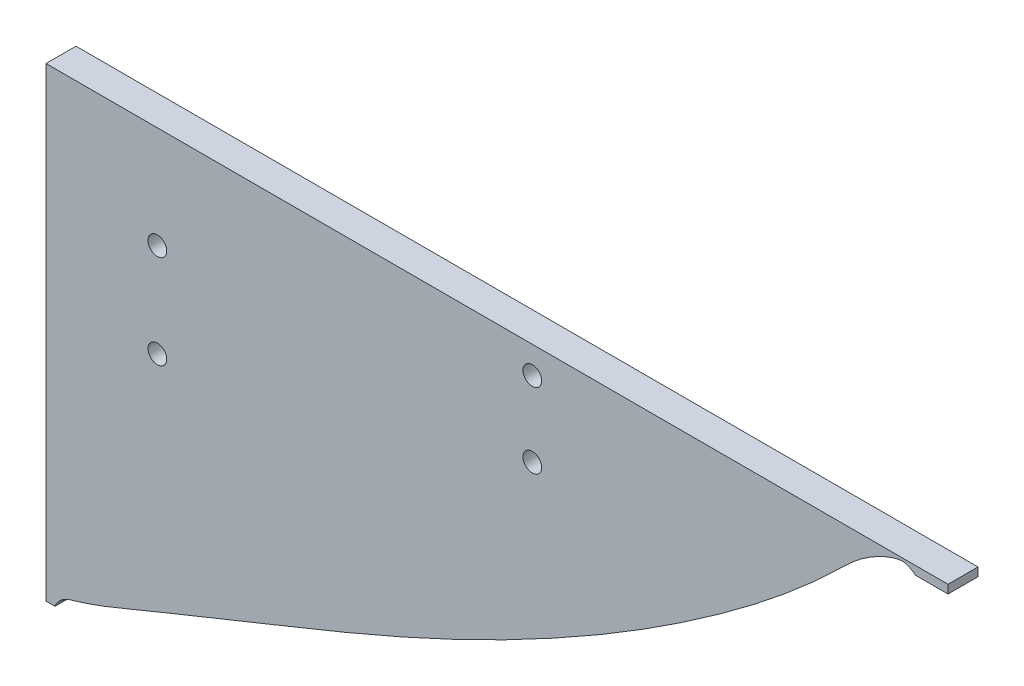
ISO-10303-21;
HEADER;
FILE_DESCRIPTION(('STEP AP214'),'2;1');
FILE_NAME('part.step','',(''),(''),'','','');
FILE_SCHEMA(('AUTOMOTIVE_DESIGN { 1 0 10303 214 1 1 1 1 }'));
ENDSEC;
DATA;
#1=APPLICATION_CONTEXT('core data for automotive mechanical design processes');
#2=APPLICATION_PROTOCOL_DEFINITION('international standard','automotive_design',2000,#1);
#3=PRODUCT_CONTEXT('',#1,'mechanical');
#4=PRODUCT('Part','Part','',(#3));
#5=PRODUCT_RELATED_PRODUCT_CATEGORY('part','',(#4));
#6=PRODUCT_DEFINITION_FORMATION('','',#4);
#7=PRODUCT_DEFINITION_CONTEXT('part definition',#1,'design');
#8=PRODUCT_DEFINITION('design','',#6,#7);
#9=PRODUCT_DEFINITION_SHAPE('','',#8);
#10=(LENGTH_UNIT() NAMED_UNIT(*) SI_UNIT(.MILLI.,.METRE.));
#11=(NAMED_UNIT(*) PLANE_ANGLE_UNIT() SI_UNIT($,.RADIAN.));
#12=(NAMED_UNIT(*) SI_UNIT($,.STERADIAN.) SOLID_ANGLE_UNIT());
#13=UNCERTAINTY_MEASURE_WITH_UNIT(LENGTH_MEASURE(1.E-05),#10,'distance_accuracy_value','');
#14=(GEOMETRIC_REPRESENTATION_CONTEXT(3) GLOBAL_UNCERTAINTY_ASSIGNED_CONTEXT((#13)) GLOBAL_UNIT_ASSIGNED_CONTEXT((#10,
#11,#12)) REPRESENTATION_CONTEXT('',''));
#15=CARTESIAN_POINT('',(0.,0.,0.));
#16=DIRECTION('',(0.,0.,1.));
#17=DIRECTION('',(1.,0.,0.));
#18=AXIS2_PLACEMENT_3D('',#15,#16,#17);
#19=CARTESIAN_POINT('',(-6.88324996712564,-69.5254297062748,124.));
#20=DIRECTION('',(0.,0.,1.));
#21=DIRECTION('',(1.,0.,0.));
#22=AXIS2_PLACEMENT_3D('',#19,#20,#21);
#23=PLANE('',#22);
#24=CARTESIAN_POINT('',(-100.,-50.,124.));
#25=DIRECTION('',(0.,0.,1.));
#26=DIRECTION('',(1.,0.,0.));
#27=AXIS2_PLACEMENT_3D('',#24,#25,#26);
#28=CIRCLE('',#27,2.5);
#29=CARTESIAN_POINT('',(-97.5,-50.,124.));
#30=VERTEX_POINT('',#29);
#31=EDGE_CURVE('E177',#30,#30,#28,.F.);
#32=ORIENTED_EDGE('',*,*,#31,.T.);
#33=EDGE_LOOP('',(#32));
#34=FACE_BOUND('',#33,.T.);
#35=CARTESIAN_POINT('',(0.0705666698621599,-4.96037406111782,124.));
#36=DIRECTION('',(0.,0.,1.));
#37=DIRECTION('',(1.,0.,0.));
#38=AXIS2_PLACEMENT_3D('',#35,#36,#37);
#39=CIRCLE('',#38,2.5);
#40=CARTESIAN_POINT('',(2.57056666986216,-4.96037406111782,124.));
#41=VERTEX_POINT('',#40);
#42=EDGE_CURVE('E165',#41,#41,#39,.F.);
#43=ORIENTED_EDGE('',*,*,#42,.T.);
#44=EDGE_LOOP('',(#43));
#45=FACE_BOUND('',#44,.T.);
#46=DIRECTION('',(0.999999959371241,0.000285057042114839,0.));
#47=VECTOR('',#46,1.);
#48=CARTESIAN_POINT('',(-129.725067732248,-122.005242301533,124.));
#49=LINE('',#48,#47);
#50=CARTESIAN_POINT('',(-129.725067732248,-122.005242301533,124.));
#51=VERTEX_POINT('',#50);
#52=CARTESIAN_POINT('',(-127.32793309838,-122.004558981397,124.));
#53=VERTEX_POINT('',#52);
#54=EDGE_CURVE('E122',#51,#53,#49,.T.);
#55=ORIENTED_EDGE('',*,*,#54,.T.);
#56=CARTESIAN_POINT('',(102.26251898165,-0.00495280443393484,124.));
#57=CARTESIAN_POINT('',(102.174347615,0.149128170390604,124.));
#58=CARTESIAN_POINT('',(102.037797393237,0.266839574242771,124.));
#59=CARTESIAN_POINT('',(101.746034350803,0.462942729789674,124.));
#60=CARTESIAN_POINT('',(101.591962582344,0.547961159505283,124.));
#61=CARTESIAN_POINT('',(101.285843103058,0.721218903729334,124.));
#62=CARTESIAN_POINT('',(101.134736428689,0.811231287811615,124.));
#63=CARTESIAN_POINT('',(100.828320860289,0.983599055372104,124.));
#64=CARTESIAN_POINT('',(100.672712935004,1.06528126432442,124.));
#65=CARTESIAN_POINT('',(100.354061105355,1.21469885216894,124.));
#66=CARTESIAN_POINT('',(100.19137695271,1.2824122287076,124.));
#67=CARTESIAN_POINT('',(99.8601701701267,1.38842782109563,124.));
#68=CARTESIAN_POINT('',(99.6910640961306,1.42700299433546,124.));
#69=CARTESIAN_POINT('',(99.3465563294801,1.47821256968827,124.));
#70=CARTESIAN_POINT('',(99.1698562988593,1.49068882210215,124.));
#71=CARTESIAN_POINT('',(98.8195310766332,1.49491889286449,124.));
#72=CARTESIAN_POINT('',(98.6455456167675,1.48690960795902,124.));
#73=CARTESIAN_POINT('',(98.1260549050978,1.44167529241598,124.));
#74=CARTESIAN_POINT('',(97.7830553235618,1.38289975296863,124.));
#75=CARTESIAN_POINT('',(97.1002765734617,1.2376508803931,124.));
#76=CARTESIAN_POINT('',(96.7612990392098,1.1501197959821,124.));
#77=CARTESIAN_POINT('',(95.7592959725952,0.850293692367678,124.));
#78=CARTESIAN_POINT('',(95.1046066410437,0.601479107198764,124.));
#79=CARTESIAN_POINT('',(93.179504596806,-0.205752796965908,124.));
#80=CARTESIAN_POINT('',(91.9580042295883,-0.831161844922086,124.));
#81=CARTESIAN_POINT('',(89.6066244432493,-2.2111270557485,124.));
#82=CARTESIAN_POINT('',(88.4811548092467,-2.971899166361,124.));
#83=CARTESIAN_POINT('',(85.2484004816342,-5.45670820551964,124.));
#84=CARTESIAN_POINT('',(83.2688135730394,-7.36170658379924,124.));
#85=CARTESIAN_POINT('',(80.3118821187309,-10.2335914045146,124.));
#86=CARTESIAN_POINT('',(79.3259621299251,-11.1905902000248,124.));
#87=CARTESIAN_POINT('',(77.3341406448988,-13.0831611226048,124.));
#88=CARTESIAN_POINT('',(76.3278707935357,-14.018338253274,124.));
#89=CARTESIAN_POINT('',(74.2884210772701,-15.8598362363616,124.));
#90=CARTESIAN_POINT('',(73.254955066095,-16.7660901962244,124.));
#91=CARTESIAN_POINT('',(71.1745492148325,-18.5627403881457,124.));
#92=CARTESIAN_POINT('',(70.1292627860669,-19.4551051377736,124.));
#93=CARTESIAN_POINT('',(68.0311463793788,-21.2309899162991,124.));
#94=CARTESIAN_POINT('',(66.9763823030301,-22.1123754065588,124.));
#95=CARTESIAN_POINT('',(64.8491166845205,-23.8530363028657,124.));
#96=CARTESIAN_POINT('',(63.7777656284095,-24.7138168514999,124.));
#97=CARTESIAN_POINT('',(60.5483097928385,-27.2771005523549,124.));
#98=CARTESIAN_POINT('',(58.3728313603113,-28.9574359065318,124.));
#99=CARTESIAN_POINT('',(53.9759473409962,-32.2575460628021,124.));
#100=CARTESIAN_POINT('',(51.75672576011,-33.8790741447532,124.));
#101=CARTESIAN_POINT('',(47.2842204858916,-37.0741039167147,124.));
#102=CARTESIAN_POINT('',(45.0307166569081,-38.6480288342912,124.));
#103=CARTESIAN_POINT('',(40.4953345024311,-41.7540350312131,124.));
#104=CARTESIAN_POINT('',(38.2136888656088,-43.285102886435,124.));
#105=CARTESIAN_POINT('',(31.3212127801184,-47.8035793809047,124.));
#106=CARTESIAN_POINT('',(26.6641140616338,-50.7182586913201,124.));
#107=CARTESIAN_POINT('',(17.2407020718045,-56.3759424006037,124.));
#108=CARTESIAN_POINT('',(12.4762954081168,-59.1196456238698,124.));
#109=CARTESIAN_POINT('',(5.26392481939088,-63.1085593971457,124.));
#110=CARTESIAN_POINT('',(2.84849064053591,-64.4175238799221,124.));
#111=CARTESIAN_POINT('',(-2.00188444302955,-66.9997987332518,124.));
#112=CARTESIAN_POINT('',(-4.43706358470978,-68.2726736577074,124.));
#113=CARTESIAN_POINT('',(-11.7756227319582,-72.0309418034101,124.));
#114=CARTESIAN_POINT('',(-16.7068646536724,-74.4539234221735,124.));
#115=CARTESIAN_POINT('',(-26.6331107893735,-79.1533110455345,124.));
#116=CARTESIAN_POINT('',(-31.6281069498576,-81.4317860239369,124.));
#117=CARTESIAN_POINT('',(-41.675614091827,-85.8602219863516,124.));
#118=CARTESIAN_POINT('',(-46.7317599919048,-88.0020609263505,124.));
#119=CARTESIAN_POINT('',(-56.8808033474624,-92.2036192917159,124.));
#120=CARTESIAN_POINT('',(-61.9734300858164,-94.2644567704339,124.));
#121=CARTESIAN_POINT('',(-72.1691002258447,-98.3597476926554,124.));
#122=CARTESIAN_POINT('',(-77.2717712479048,-100.395381745915,124.));
#123=CARTESIAN_POINT('',(-87.4627147635268,-104.502412530932,124.));
#124=CARTESIAN_POINT('',(-92.5492896977023,-106.578080634739,124.));
#125=CARTESIAN_POINT('',(-100.170864371142,-109.711687869284,124.));
#126=CARTESIAN_POINT('',(-102.709995473474,-110.759613659589,124.));
#127=CARTESIAN_POINT('',(-106.521025133495,-112.325820626452,124.));
#128=CARTESIAN_POINT('',(-107.791852457135,-112.846708116865,124.));
#129=CARTESIAN_POINT('',(-110.334473480991,-113.886124568566,124.));
#130=CARTESIAN_POINT('',(-111.605090350333,-114.407747450284,124.));
#131=CARTESIAN_POINT('',(-114.154226768546,-115.430343693977,124.));
#132=CARTESIAN_POINT('',(-115.434170770218,-115.927619882287,124.));
#133=CARTESIAN_POINT('',(-117.375087835552,-116.618756101127,124.));
#134=CARTESIAN_POINT('',(-118.025500549462,-116.840432004935,124.));
#135=CARTESIAN_POINT('',(-119.333742982013,-117.262321575368,124.));
#136=CARTESIAN_POINT('',(-119.992602264904,-117.459739209321,124.));
#137=CARTESIAN_POINT('',(-121.314244300222,-117.843372995663,124.));
#138=CARTESIAN_POINT('',(-121.975444737864,-118.034106647098,124.));
#139=CARTESIAN_POINT('',(-122.952902607353,-118.361155693493,124.));
#140=CARTESIAN_POINT('',(-123.276614765556,-118.476187890223,124.));
#141=CARTESIAN_POINT('',(-123.916262953297,-118.728453083544,124.));
#142=CARTESIAN_POINT('',(-124.232228504641,-118.865601795558,124.));
#143=CARTESIAN_POINT('',(-124.849977851703,-119.180388045319,124.));
#144=CARTESIAN_POINT('',(-125.154527848185,-119.360807943423,124.));
#145=CARTESIAN_POINT('',(-125.714717339744,-119.770885583609,124.));
#146=CARTESIAN_POINT('',(-125.969290628527,-120.004532291453,124.));
#147=CARTESIAN_POINT('',(-126.437608768237,-120.517591721493,124.));
#148=CARTESIAN_POINT('',(-126.653016819968,-120.795739097796,124.));
#149=CARTESIAN_POINT('',(-126.959187089291,-121.221270275862,124.));
#150=CARTESIAN_POINT('',(-127.061691742381,-121.36280317036,124.));
#151=CARTESIAN_POINT('',(-127.239937245773,-121.664442515581,124.));
#152=CARTESIAN_POINT('',(-127.313584618713,-121.827483242957,124.));
#153=CARTESIAN_POINT('',(-127.32793309838,-122.004558981397,124.));
#154=B_SPLINE_CURVE_WITH_KNOTS('',3,(#56,#57,#58,#59,#60,#61,#62,#63,#64,#65,#66,#67,#68,#69,
#70,#71,#72,#73,#74,#75,#76,#77,#78,#79,#80,#81,#82,#83,#84,#85,#86,#87,#88,#89,#90,#91,#92,#93,
#94,#95,#96,#97,#98,#99,#100,#101,#102,#103,#104,#105,#106,#107,#108,#109,#110,#111,#112,#113,
#114,#115,#116,#117,#118,#119,#120,#121,#122,#123,#124,#125,#126,#127,#128,#129,#130,#131,#132,
#133,#134,#135,#136,#137,#138,#139,#140,#141,#142,#143,#144,#145,#146,#147,#148,#149,#150,#151,
#152,#153),.UNSPECIFIED.,.F.,.F.,(4,2,2,2,2,2,2,2,2,2,2,2,2,2,2,2,2,2,2,2,2,2,2,2,2,2,2,2,2,2,2,
2,2,2,2,2,2,2,2,2,2,2,2,2,2,2,2,2,4),(0.,0.00195312500000011,0.00390625000000011,
0.00585937500000022,0.00781250000000022,0.00976562500000033,0.0117187500000004,
0.0136718750000004,0.0156250000000006,0.0195312500000006,0.0234375000000006,0.0312500000000007,
0.0468750000000008,0.062500000000001,0.0937500000000013,0.109375000000001,0.125000000000001,
0.140625000000002,0.156250000000002,0.171875000000002,0.187500000000002,0.218750000000002,
0.250000000000002,0.281250000000002,0.312500000000002,0.375000000000001,0.437500000000001,
0.468750000000001,0.500000000000001,0.562500000000001,0.625000000000001,0.687500000000001,
0.750000000000001,0.812500000000001,0.875,0.90625,0.921875,0.9375,0.953125,0.9609375,
0.968750000000001,0.976562500000001,0.98046875,0.984375,0.98828125,0.9921875,0.99609375,
0.998046875,1.),.UNSPECIFIED.);
#155=CARTESIAN_POINT('',(102.26251898165,-0.00495280443392107,124.));
#156=VERTEX_POINT('',#155);
#157=EDGE_CURVE('E86',#53,#156,#154,.F.);
#158=ORIENTED_EDGE('',*,*,#157,.T.);
#159=DIRECTION('',(0.999999999986576,-5.18144427124082E-06,0.));
#160=VECTOR('',#159,1.);
#161=CARTESIAN_POINT('',(102.26251898165,-0.00495280443392107,124.));
#162=LINE('',#161,#160);
#163=CARTESIAN_POINT('',(111.009443337621,-0.0049981261350169,124.));
#164=VERTEX_POINT('',#163);
#165=EDGE_CURVE('E100',#156,#164,#162,.T.);
#166=ORIENTED_EDGE('',*,*,#165,.T.);
#167=DIRECTION('',(0.,1.,0.));
#168=VECTOR('',#167,1.);
#169=CARTESIAN_POINT('',(111.009443337621,2.25600000000004,124.));
#170=LINE('',#169,#168);
#171=CARTESIAN_POINT('',(111.009443337621,2.25600000000004,124.));
#172=VERTEX_POINT('',#171);
#173=EDGE_CURVE('E94',#164,#172,#170,.T.);
#174=ORIENTED_EDGE('',*,*,#173,.T.);
#175=DIRECTION('',(-1.,0.,0.));
#176=VECTOR('',#175,1.);
#177=CARTESIAN_POINT('',(111.009443337621,2.25600000000004,124.));
#178=LINE('',#177,#176);
#179=CARTESIAN_POINT('',(-129.725067732248,2.25600000000001,124.));
#180=VERTEX_POINT('',#179);
#181=EDGE_CURVE('E98',#172,#180,#178,.T.);
#182=ORIENTED_EDGE('',*,*,#181,.T.);
#183=DIRECTION('',(0.,-1.,0.));
#184=VECTOR('',#183,1.);
#185=CARTESIAN_POINT('',(-129.725067732248,-122.005242301533,124.));
#186=LINE('',#185,#184);
#187=EDGE_CURVE('E49',#180,#51,#186,.T.);
#188=ORIENTED_EDGE('',*,*,#187,.T.);
#189=EDGE_LOOP('',(#55,#158,#166,#174,#182,#188));
#190=FACE_BOUND('',#189,.T.);
#191=CARTESIAN_POINT('',(0.0705666698621599,-25.,124.));
#192=DIRECTION('',(0.,0.,1.));
#193=DIRECTION('',(1.,0.,0.));
#194=AXIS2_PLACEMENT_3D('',#191,#192,#193);
#195=CIRCLE('',#194,2.5);
#196=CARTESIAN_POINT('',(2.57056666986216,-25.,124.));
#197=VERTEX_POINT('',#196);
#198=EDGE_CURVE('E174',#197,#197,#195,.F.);
#199=ORIENTED_EDGE('',*,*,#198,.T.);
#200=EDGE_LOOP('',(#199));
#201=FACE_BOUND('',#200,.T.);
#202=CARTESIAN_POINT('',(-100.,-25.,124.));
#203=DIRECTION('',(0.,0.,1.));
#204=DIRECTION('',(1.,0.,0.));
#205=AXIS2_PLACEMENT_3D('',#202,#203,#204);
#206=CIRCLE('',#205,2.5);
#207=CARTESIAN_POINT('',(-97.5,-25.,124.));
#208=VERTEX_POINT('',#207);
#209=EDGE_CURVE('E180',#208,#208,#206,.F.);
#210=ORIENTED_EDGE('',*,*,#209,.T.);
#211=EDGE_LOOP('',(#210));
#212=FACE_BOUND('',#211,.T.);
#213=ADVANCED_FACE('F30',(#34,#45,#190,#201,#212),#23,.T.);
#214=CARTESIAN_POINT('',(-6.88324996712564,-69.5254297062748,116.));
#215=DIRECTION('',(0.,0.,1.));
#216=DIRECTION('',(1.,0.,0.));
#217=AXIS2_PLACEMENT_3D('',#214,#215,#216);
#218=PLANE('',#217);
#219=CARTESIAN_POINT('',(-100.,-50.,116.));
#220=DIRECTION('',(0.,0.,1.));
#221=DIRECTION('',(1.,0.,0.));
#222=AXIS2_PLACEMENT_3D('',#219,#220,#221);
#223=CIRCLE('',#222,2.5);
#224=CARTESIAN_POINT('',(-97.5,-50.,116.));
#225=VERTEX_POINT('',#224);
#226=EDGE_CURVE('E178',#225,#225,#223,.F.);
#227=ORIENTED_EDGE('',*,*,#226,.F.);
#228=EDGE_LOOP('',(#227));
#229=FACE_BOUND('',#228,.T.);
#230=CARTESIAN_POINT('',(0.0705666698621599,-4.96037406111782,116.));
#231=DIRECTION('',(0.,0.,1.));
#232=DIRECTION('',(1.,0.,0.));
#233=AXIS2_PLACEMENT_3D('',#230,#231,#232);
#234=CIRCLE('',#233,2.5);
#235=CARTESIAN_POINT('',(2.57056666986216,-4.96037406111782,116.));
#236=VERTEX_POINT('',#235);
#237=EDGE_CURVE('E171',#236,#236,#234,.F.);
#238=ORIENTED_EDGE('',*,*,#237,.F.);
#239=EDGE_LOOP('',(#238));
#240=FACE_BOUND('',#239,.T.);
#241=DIRECTION('',(0.999999959371241,0.000285057042114839,0.));
#242=VECTOR('',#241,1.);
#243=CARTESIAN_POINT('',(-129.725067732248,-122.005242301533,116.));
#244=LINE('',#243,#242);
#245=CARTESIAN_POINT('',(-129.725067732248,-122.005242301533,116.));
#246=VERTEX_POINT('',#245);
#247=CARTESIAN_POINT('',(-127.32793309838,-122.004558981397,116.));
#248=VERTEX_POINT('',#247);
#249=EDGE_CURVE('E156',#246,#248,#244,.T.);
#250=ORIENTED_EDGE('',*,*,#249,.F.);
#251=DIRECTION('',(0.,-1.,0.));
#252=VECTOR('',#251,1.);
#253=CARTESIAN_POINT('',(-129.725067732248,-122.005242301533,116.));
#254=LINE('',#253,#252);
#255=CARTESIAN_POINT('',(-129.725067732248,2.25600000000001,116.));
#256=VERTEX_POINT('',#255);
#257=EDGE_CURVE('E78',#256,#246,#254,.T.);
#258=ORIENTED_EDGE('',*,*,#257,.F.);
#259=DIRECTION('',(-1.,0.,0.));
#260=VECTOR('',#259,1.);
#261=CARTESIAN_POINT('',(111.009443337621,2.25600000000004,116.));
#262=LINE('',#261,#260);
#263=CARTESIAN_POINT('',(111.009443337621,2.25600000000004,116.));
#264=VERTEX_POINT('',#263);
#265=EDGE_CURVE('E72',#264,#256,#262,.T.);
#266=ORIENTED_EDGE('',*,*,#265,.F.);
#267=DIRECTION('',(0.,1.,0.));
#268=VECTOR('',#267,1.);
#269=CARTESIAN_POINT('',(111.009443337621,2.25600000000004,116.));
#270=LINE('',#269,#268);
#271=CARTESIAN_POINT('',(111.009443337621,-0.0049981261350169,116.));
#272=VERTEX_POINT('',#271);
#273=EDGE_CURVE('E108',#272,#264,#270,.T.);
#274=ORIENTED_EDGE('',*,*,#273,.F.);
#275=DIRECTION('',(0.999999999986576,-5.18144427124082E-06,0.));
#276=VECTOR('',#275,1.);
#277=CARTESIAN_POINT('',(102.26251898165,-0.00495280443392107,116.));
#278=LINE('',#277,#276);
#279=CARTESIAN_POINT('',(102.26251898165,-0.00495280443392107,116.));
#280=VERTEX_POINT('',#279);
#281=EDGE_CURVE('E119',#280,#272,#278,.T.);
#282=ORIENTED_EDGE('',*,*,#281,.F.);
#283=CARTESIAN_POINT('',(-127.32793309838,-122.004558981397,116.));
#284=CARTESIAN_POINT('',(-127.313584618713,-121.827483242957,116.));
#285=CARTESIAN_POINT('',(-127.239937245773,-121.664442515581,116.));
#286=CARTESIAN_POINT('',(-127.061691742381,-121.36280317036,116.));
#287=CARTESIAN_POINT('',(-126.959187089291,-121.221270275862,116.));
#288=CARTESIAN_POINT('',(-126.653016819968,-120.795739097796,116.));
#289=CARTESIAN_POINT('',(-126.437608768237,-120.517591721493,116.));
#290=CARTESIAN_POINT('',(-125.969290628527,-120.004532291453,116.));
#291=CARTESIAN_POINT('',(-125.714717339744,-119.770885583609,116.));
#292=CARTESIAN_POINT('',(-125.154527848185,-119.360807943423,116.));
#293=CARTESIAN_POINT('',(-124.849977851703,-119.180388045319,116.));
#294=CARTESIAN_POINT('',(-124.232228504641,-118.865601795558,116.));
#295=CARTESIAN_POINT('',(-123.916262953297,-118.728453083544,116.));
#296=CARTESIAN_POINT('',(-123.276614765556,-118.476187890223,116.));
#297=CARTESIAN_POINT('',(-122.952902607353,-118.361155693493,116.));
#298=CARTESIAN_POINT('',(-121.975444737864,-118.034106647098,116.));
#299=CARTESIAN_POINT('',(-121.314244300222,-117.843372995663,116.));
#300=CARTESIAN_POINT('',(-119.992602264904,-117.459739209321,116.));
#301=CARTESIAN_POINT('',(-119.333742982013,-117.262321575368,116.));
#302=CARTESIAN_POINT('',(-118.025500549462,-116.840432004935,116.));
#303=CARTESIAN_POINT('',(-117.375087835552,-116.618756101127,116.));
#304=CARTESIAN_POINT('',(-115.434170770218,-115.927619882287,116.));
#305=CARTESIAN_POINT('',(-114.154226768546,-115.430343693977,116.));
#306=CARTESIAN_POINT('',(-111.605090350333,-114.407747450284,116.));
#307=CARTESIAN_POINT('',(-110.334473480991,-113.886124568566,116.));
#308=CARTESIAN_POINT('',(-107.791852457135,-112.846708116865,116.));
#309=CARTESIAN_POINT('',(-106.521025133495,-112.325820626452,116.));
#310=CARTESIAN_POINT('',(-102.709995473474,-110.759613659589,116.));
#311=CARTESIAN_POINT('',(-100.170864371142,-109.711687869284,116.));
#312=CARTESIAN_POINT('',(-92.5492896977023,-106.578080634739,116.));
#313=CARTESIAN_POINT('',(-87.4627147635268,-104.502412530932,116.));
#314=CARTESIAN_POINT('',(-77.2717712479048,-100.395381745915,116.));
#315=CARTESIAN_POINT('',(-72.1691002258447,-98.3597476926554,116.));
#316=CARTESIAN_POINT('',(-61.9734300858164,-94.2644567704339,116.));
#317=CARTESIAN_POINT('',(-56.8808033474624,-92.2036192917159,116.));
#318=CARTESIAN_POINT('',(-46.7317599919048,-88.0020609263505,116.));
#319=CARTESIAN_POINT('',(-41.675614091827,-85.8602219863516,116.));
#320=CARTESIAN_POINT('',(-31.6281069498576,-81.4317860239369,116.));
#321=CARTESIAN_POINT('',(-26.6331107893735,-79.1533110455345,116.));
#322=CARTESIAN_POINT('',(-16.7068646536724,-74.4539234221735,116.));
#323=CARTESIAN_POINT('',(-11.7756227319582,-72.0309418034101,116.));
#324=CARTESIAN_POINT('',(-4.43706358470978,-68.2726736577074,116.));
#325=CARTESIAN_POINT('',(-2.00188444302955,-66.9997987332518,116.));
#326=CARTESIAN_POINT('',(2.84849064053591,-64.4175238799221,116.));
#327=CARTESIAN_POINT('',(5.26392481939088,-63.1085593971457,116.));
#328=CARTESIAN_POINT('',(12.4762954081168,-59.1196456238698,116.));
#329=CARTESIAN_POINT('',(17.2407020718045,-56.3759424006037,116.));
#330=CARTESIAN_POINT('',(26.6641140616338,-50.7182586913201,116.));
#331=CARTESIAN_POINT('',(31.3212127801184,-47.8035793809047,116.));
#332=CARTESIAN_POINT('',(38.2136888656088,-43.285102886435,116.));
#333=CARTESIAN_POINT('',(40.4953345024311,-41.7540350312131,116.));
#334=CARTESIAN_POINT('',(45.0307166569081,-38.6480288342912,116.));
#335=CARTESIAN_POINT('',(47.2842204858916,-37.0741039167147,116.));
#336=CARTESIAN_POINT('',(51.75672576011,-33.8790741447532,116.));
#337=CARTESIAN_POINT('',(53.9759473409962,-32.2575460628021,116.));
#338=CARTESIAN_POINT('',(58.3728313603113,-28.9574359065318,116.));
#339=CARTESIAN_POINT('',(60.5483097928385,-27.2771005523549,116.));
#340=CARTESIAN_POINT('',(63.7777656284095,-24.7138168514999,116.));
#341=CARTESIAN_POINT('',(64.8491166845205,-23.8530363028657,116.));
#342=CARTESIAN_POINT('',(66.9763823030301,-22.1123754065588,116.));
#343=CARTESIAN_POINT('',(68.0311463793788,-21.2309899162991,116.));
#344=CARTESIAN_POINT('',(70.1292627860669,-19.4551051377736,116.));
#345=CARTESIAN_POINT('',(71.1745492148325,-18.5627403881457,116.));
#346=CARTESIAN_POINT('',(73.254955066095,-16.7660901962244,116.));
#347=CARTESIAN_POINT('',(74.2884210772701,-15.8598362363616,116.));
#348=CARTESIAN_POINT('',(76.3278707935357,-14.018338253274,116.));
#349=CARTESIAN_POINT('',(77.3341406448988,-13.0831611226048,116.));
#350=CARTESIAN_POINT('',(79.3259621299251,-11.1905902000248,116.));
#351=CARTESIAN_POINT('',(80.3118821187309,-10.2335914045146,116.));
#352=CARTESIAN_POINT('',(83.2688135730394,-7.36170658379924,116.));
#353=CARTESIAN_POINT('',(85.2484004816342,-5.45670820551964,116.));
#354=CARTESIAN_POINT('',(88.4811548092467,-2.971899166361,116.));
#355=CARTESIAN_POINT('',(89.6066244432493,-2.2111270557485,116.));
#356=CARTESIAN_POINT('',(91.9580042295883,-0.831161844922086,116.));
#357=CARTESIAN_POINT('',(93.179504596806,-0.205752796965908,116.));
#358=CARTESIAN_POINT('',(95.1046066410437,0.601479107198764,116.));
#359=CARTESIAN_POINT('',(95.7592959725952,0.850293692367678,116.));
#360=CARTESIAN_POINT('',(96.7612990392098,1.1501197959821,116.));
#361=CARTESIAN_POINT('',(97.1002765734617,1.2376508803931,116.));
#362=CARTESIAN_POINT('',(97.7830553235618,1.38289975296863,116.));
#363=CARTESIAN_POINT('',(98.1260549050978,1.44167529241598,116.));
#364=CARTESIAN_POINT('',(98.6455456167675,1.48690960795902,116.));
#365=CARTESIAN_POINT('',(98.8195310766332,1.49491889286449,116.));
#366=CARTESIAN_POINT('',(99.1698562988593,1.49068882210215,116.));
#367=CARTESIAN_POINT('',(99.3465563294801,1.47821256968827,116.));
#368=CARTESIAN_POINT('',(99.6910640961306,1.42700299433546,116.));
#369=CARTESIAN_POINT('',(99.8601701701267,1.38842782109563,116.));
#370=CARTESIAN_POINT('',(100.19137695271,1.2824122287076,116.));
#371=CARTESIAN_POINT('',(100.354061105355,1.21469885216894,116.));
#372=CARTESIAN_POINT('',(100.672712935004,1.06528126432442,116.));
#373=CARTESIAN_POINT('',(100.828320860289,0.983599055372104,116.));
#374=CARTESIAN_POINT('',(101.134736428689,0.811231287811615,116.));
#375=CARTESIAN_POINT('',(101.285843103058,0.721218903729334,116.));
#376=CARTESIAN_POINT('',(101.591962582344,0.547961159505283,116.));
#377=CARTESIAN_POINT('',(101.746034350803,0.462942729789674,116.));
#378=CARTESIAN_POINT('',(102.037797393237,0.266839574242771,116.));
#379=CARTESIAN_POINT('',(102.174347615,0.149128170390604,116.));
#380=CARTESIAN_POINT('',(102.26251898165,-0.00495280443393484,116.));
#381=B_SPLINE_CURVE_WITH_KNOTS('',3,(#283,#284,#285,#286,#287,#288,#289,#290,#291,#292,#293,
#294,#295,#296,#297,#298,#299,#300,#301,#302,#303,#304,#305,#306,#307,#308,#309,#310,#311,#312,
#313,#314,#315,#316,#317,#318,#319,#320,#321,#322,#323,#324,#325,#326,#327,#328,#329,#330,#331,
#332,#333,#334,#335,#336,#337,#338,#339,#340,#341,#342,#343,#344,#345,#346,#347,#348,#349,#350,
#351,#352,#353,#354,#355,#356,#357,#358,#359,#360,#361,#362,#363,#364,#365,#366,#367,#368,#369,
#370,#371,#372,#373,#374,#375,#376,#377,#378,#379,#380),.UNSPECIFIED.,.F.,.F.,(4,2,2,2,2,2,2,2,
2,2,2,2,2,2,2,2,2,2,2,2,2,2,2,2,2,2,2,2,2,2,2,2,2,2,2,2,2,2,2,2,2,2,2,2,2,2,2,2,4),(0.,
0.00195312499999995,0.00390624999999991,0.00781249999999982,0.0117187499999997,
0.0156249999999996,0.0195312499999995,0.0234374999999995,0.0312499999999995,0.0390624999999995,
0.0468749999999995,0.0624999999999996,0.0781249999999996,0.0937499999999996,0.125,
0.187499999999999,0.249999999999999,0.312499999999999,0.374999999999999,0.437499999999999,
0.499999999999999,0.531249999999999,0.562499999999999,0.624999999999999,0.687499999999998,
0.718749999999998,0.749999999999998,0.781249999999998,0.812499999999998,0.828124999999998,
0.843749999999998,0.859374999999998,0.874999999999999,0.890624999999999,0.906249999999999,
0.937499999999999,0.953124999999999,0.968749999999999,0.976562499999999,0.980468749999999,
0.984374999999999,0.986328125,0.98828125,0.990234375,0.9921875,0.994140625,0.99609375,
0.998046875,1.),.UNSPECIFIED.);
#382=EDGE_CURVE('E164',#248,#280,#381,.T.);
#383=ORIENTED_EDGE('',*,*,#382,.F.);
#384=EDGE_LOOP('',(#250,#258,#266,#274,#282,#383));
#385=FACE_BOUND('',#384,.T.);
#386=CARTESIAN_POINT('',(0.0705666698621599,-25.,116.));
#387=DIRECTION('',(0.,0.,1.));
#388=DIRECTION('',(1.,0.,0.));
#389=AXIS2_PLACEMENT_3D('',#386,#387,#388);
#390=CIRCLE('',#389,2.5);
#391=CARTESIAN_POINT('',(2.57056666986216,-25.,116.));
#392=VERTEX_POINT('',#391);
#393=EDGE_CURVE('E175',#392,#392,#390,.F.);
#394=ORIENTED_EDGE('',*,*,#393,.F.);
#395=EDGE_LOOP('',(#394));
#396=FACE_BOUND('',#395,.T.);
#397=CARTESIAN_POINT('',(-100.,-25.,116.));
#398=DIRECTION('',(0.,0.,1.));
#399=DIRECTION('',(1.,0.,0.));
#400=AXIS2_PLACEMENT_3D('',#397,#398,#399);
#401=CIRCLE('',#400,2.5);
#402=CARTESIAN_POINT('',(-97.5,-25.,116.));
#403=VERTEX_POINT('',#402);
#404=EDGE_CURVE('E34',#403,#403,#401,.F.);
#405=ORIENTED_EDGE('',*,*,#404,.F.);
#406=EDGE_LOOP('',(#405));
#407=FACE_BOUND('',#406,.T.);
#408=ADVANCED_FACE('F140',(#229,#240,#385,#396,#407),#218,.F.);
#409=CARTESIAN_POINT('',(-129.725067732248,-122.005242301533,124.));
#410=DIRECTION('',(-0.000285057042114839,0.999999959371241,0.));
#411=DIRECTION('',(-0.999999959371241,-0.000285057042114839,0.));
#412=AXIS2_PLACEMENT_3D('',#409,#410,#411);
#413=PLANE('',#412);
#414=ORIENTED_EDGE('',*,*,#249,.T.);
#415=DIRECTION('',(0.,0.,-1.));
#416=VECTOR('',#415,1.);
#417=CARTESIAN_POINT('',(-127.32793309838,-122.004558981397,124.));
#418=LINE('',#417,#416);
#419=EDGE_CURVE('E11',#53,#248,#418,.T.);
#420=ORIENTED_EDGE('',*,*,#419,.F.);
#421=ORIENTED_EDGE('',*,*,#54,.F.);
#422=DIRECTION('',(0.,0.,-1.));
#423=VECTOR('',#422,1.);
#424=CARTESIAN_POINT('',(-129.725067732248,-122.005242301533,124.));
#425=LINE('',#424,#423);
#426=EDGE_CURVE('E114',#51,#246,#425,.T.);
#427=ORIENTED_EDGE('',*,*,#426,.T.);
#428=EDGE_LOOP('',(#414,#420,#421,#427));
#429=FACE_BOUND('',#428,.T.);
#430=ADVANCED_FACE('F32',(#429),#413,.F.);
#431=CARTESIAN_POINT('',(-127.32793309838,-122.004558981397,124.));
#432=CARTESIAN_POINT('',(-127.313584618713,-121.827483242957,124.));
#433=CARTESIAN_POINT('',(-127.239937245773,-121.664442515581,124.));
#434=CARTESIAN_POINT('',(-127.061691742381,-121.36280317036,124.));
#435=CARTESIAN_POINT('',(-126.959187089291,-121.221270275862,124.));
#436=CARTESIAN_POINT('',(-126.653016819968,-120.795739097796,124.));
#437=CARTESIAN_POINT('',(-126.437608768237,-120.517591721493,124.));
#438=CARTESIAN_POINT('',(-125.969290628527,-120.004532291453,124.));
#439=CARTESIAN_POINT('',(-125.714717339744,-119.770885583609,124.));
#440=CARTESIAN_POINT('',(-125.154527848185,-119.360807943423,124.));
#441=CARTESIAN_POINT('',(-124.849977851703,-119.180388045319,124.));
#442=CARTESIAN_POINT('',(-124.232228504641,-118.865601795558,124.));
#443=CARTESIAN_POINT('',(-123.916262953297,-118.728453083544,124.));
#444=CARTESIAN_POINT('',(-123.276614765556,-118.476187890223,124.));
#445=CARTESIAN_POINT('',(-122.952902607353,-118.361155693493,124.));
#446=CARTESIAN_POINT('',(-121.975444737864,-118.034106647098,124.));
#447=CARTESIAN_POINT('',(-121.314244300222,-117.843372995663,124.));
#448=CARTESIAN_POINT('',(-119.992602264904,-117.459739209321,124.));
#449=CARTESIAN_POINT('',(-119.333742982013,-117.262321575368,124.));
#450=CARTESIAN_POINT('',(-118.025500549462,-116.840432004935,124.));
#451=CARTESIAN_POINT('',(-117.375087835552,-116.618756101127,124.));
#452=CARTESIAN_POINT('',(-115.434170770218,-115.927619882287,124.));
#453=CARTESIAN_POINT('',(-114.154226768546,-115.430343693977,124.));
#454=CARTESIAN_POINT('',(-111.605090350333,-114.407747450284,124.));
#455=CARTESIAN_POINT('',(-110.334473480991,-113.886124568566,124.));
#456=CARTESIAN_POINT('',(-107.791852457135,-112.846708116865,124.));
#457=CARTESIAN_POINT('',(-106.521025133495,-112.325820626452,124.));
#458=CARTESIAN_POINT('',(-102.709995473474,-110.759613659589,124.));
#459=CARTESIAN_POINT('',(-100.170864371142,-109.711687869284,124.));
#460=CARTESIAN_POINT('',(-92.5492896977023,-106.578080634739,124.));
#461=CARTESIAN_POINT('',(-87.4627147635268,-104.502412530932,124.));
#462=CARTESIAN_POINT('',(-77.2717712479048,-100.395381745915,124.));
#463=CARTESIAN_POINT('',(-72.1691002258447,-98.3597476926554,124.));
#464=CARTESIAN_POINT('',(-61.9734300858164,-94.2644567704339,124.));
#465=CARTESIAN_POINT('',(-56.8808033474624,-92.2036192917159,124.));
#466=CARTESIAN_POINT('',(-46.7317599919048,-88.0020609263505,124.));
#467=CARTESIAN_POINT('',(-41.675614091827,-85.8602219863516,124.));
#468=CARTESIAN_POINT('',(-31.6281069498576,-81.4317860239369,124.));
#469=CARTESIAN_POINT('',(-26.6331107893735,-79.1533110455345,124.));
#470=CARTESIAN_POINT('',(-16.7068646536724,-74.4539234221735,124.));
#471=CARTESIAN_POINT('',(-11.7756227319582,-72.0309418034101,124.));
#472=CARTESIAN_POINT('',(-4.43706358470978,-68.2726736577074,124.));
#473=CARTESIAN_POINT('',(-2.00188444302955,-66.9997987332518,124.));
#474=CARTESIAN_POINT('',(2.84849064053591,-64.4175238799221,124.));
#475=CARTESIAN_POINT('',(5.26392481939088,-63.1085593971457,124.));
#476=CARTESIAN_POINT('',(12.4762954081168,-59.1196456238698,124.));
#477=CARTESIAN_POINT('',(17.2407020718045,-56.3759424006037,124.));
#478=CARTESIAN_POINT('',(26.6641140616338,-50.7182586913201,124.));
#479=CARTESIAN_POINT('',(31.3212127801184,-47.8035793809047,124.));
#480=CARTESIAN_POINT('',(38.2136888656088,-43.285102886435,124.));
#481=CARTESIAN_POINT('',(40.4953345024311,-41.7540350312131,124.));
#482=CARTESIAN_POINT('',(45.0307166569081,-38.6480288342912,124.));
#483=CARTESIAN_POINT('',(47.2842204858916,-37.0741039167147,124.));
#484=CARTESIAN_POINT('',(51.75672576011,-33.8790741447532,124.));
#485=CARTESIAN_POINT('',(53.9759473409962,-32.2575460628021,124.));
#486=CARTESIAN_POINT('',(58.3728313603113,-28.9574359065318,124.));
#487=CARTESIAN_POINT('',(60.5483097928385,-27.2771005523549,124.));
#488=CARTESIAN_POINT('',(63.7777656284095,-24.7138168514999,124.));
#489=CARTESIAN_POINT('',(64.8491166845205,-23.8530363028657,124.));
#490=CARTESIAN_POINT('',(66.9763823030301,-22.1123754065588,124.));
#491=CARTESIAN_POINT('',(68.0311463793788,-21.2309899162991,124.));
#492=CARTESIAN_POINT('',(70.1292627860669,-19.4551051377736,124.));
#493=CARTESIAN_POINT('',(71.1745492148325,-18.5627403881457,124.));
#494=CARTESIAN_POINT('',(73.254955066095,-16.7660901962244,124.));
#495=CARTESIAN_POINT('',(74.2884210772701,-15.8598362363616,124.));
#496=CARTESIAN_POINT('',(76.3278707935357,-14.018338253274,124.));
#497=CARTESIAN_POINT('',(77.3341406448988,-13.0831611226048,124.));
#498=CARTESIAN_POINT('',(79.3259621299251,-11.1905902000248,124.));
#499=CARTESIAN_POINT('',(80.3118821187309,-10.2335914045146,124.));
#500=CARTESIAN_POINT('',(83.2688135730394,-7.36170658379924,124.));
#501=CARTESIAN_POINT('',(85.2484004816342,-5.45670820551964,124.));
#502=CARTESIAN_POINT('',(88.4811548092467,-2.971899166361,124.));
#503=CARTESIAN_POINT('',(89.6066244432493,-2.2111270557485,124.));
#504=CARTESIAN_POINT('',(91.9580042295883,-0.831161844922086,124.));
#505=CARTESIAN_POINT('',(93.179504596806,-0.205752796965908,124.));
#506=CARTESIAN_POINT('',(95.1046066410437,0.601479107198764,124.));
#507=CARTESIAN_POINT('',(95.7592959725952,0.850293692367678,124.));
#508=CARTESIAN_POINT('',(96.7612990392098,1.1501197959821,124.));
#509=CARTESIAN_POINT('',(97.1002765734617,1.2376508803931,124.));
#510=CARTESIAN_POINT('',(97.7830553235618,1.38289975296863,124.));
#511=CARTESIAN_POINT('',(98.1260549050978,1.44167529241598,124.));
#512=CARTESIAN_POINT('',(98.6455456167675,1.48690960795902,124.));
#513=CARTESIAN_POINT('',(98.8195310766332,1.49491889286449,124.));
#514=CARTESIAN_POINT('',(99.1698562988593,1.49068882210215,124.));
#515=CARTESIAN_POINT('',(99.3465563294801,1.47821256968827,124.));
#516=CARTESIAN_POINT('',(99.6910640961306,1.42700299433546,124.));
#517=CARTESIAN_POINT('',(99.8601701701267,1.38842782109563,124.));
#518=CARTESIAN_POINT('',(100.19137695271,1.2824122287076,124.));
#519=CARTESIAN_POINT('',(100.354061105355,1.21469885216894,124.));
#520=CARTESIAN_POINT('',(100.672712935004,1.06528126432442,124.));
#521=CARTESIAN_POINT('',(100.828320860289,0.983599055372104,124.));
#522=CARTESIAN_POINT('',(101.134736428689,0.811231287811615,124.));
#523=CARTESIAN_POINT('',(101.285843103058,0.721218903729334,124.));
#524=CARTESIAN_POINT('',(101.591962582344,0.547961159505283,124.));
#525=CARTESIAN_POINT('',(101.746034350803,0.462942729789674,124.));
#526=CARTESIAN_POINT('',(102.037797393237,0.266839574242771,124.));
#527=CARTESIAN_POINT('',(102.174347615,0.149128170390604,124.));
#528=CARTESIAN_POINT('',(102.26251898165,-0.00495280443393484,124.));
#529=B_SPLINE_CURVE_WITH_KNOTS('',3,(#431,#432,#433,#434,#435,#436,#437,#438,#439,#440,#441,
#442,#443,#444,#445,#446,#447,#448,#449,#450,#451,#452,#453,#454,#455,#456,#457,#458,#459,#460,
#461,#462,#463,#464,#465,#466,#467,#468,#469,#470,#471,#472,#473,#474,#475,#476,#477,#478,#479,
#480,#481,#482,#483,#484,#485,#486,#487,#488,#489,#490,#491,#492,#493,#494,#495,#496,#497,#498,
#499,#500,#501,#502,#503,#504,#505,#506,#507,#508,#509,#510,#511,#512,#513,#514,#515,#516,#517,
#518,#519,#520,#521,#522,#523,#524,#525,#526,#527,#528),.UNSPECIFIED.,.F.,.F.,(4,2,2,2,2,2,2,2,
2,2,2,2,2,2,2,2,2,2,2,2,2,2,2,2,2,2,2,2,2,2,2,2,2,2,2,2,2,2,2,2,2,2,2,2,2,2,2,2,4),(0.,
0.00195312499999995,0.00390624999999991,0.00781249999999982,0.0117187499999997,
0.0156249999999996,0.0195312499999995,0.0234374999999995,0.0312499999999995,0.0390624999999995,
0.0468749999999995,0.0624999999999996,0.0781249999999996,0.0937499999999996,0.125,
0.187499999999999,0.249999999999999,0.312499999999999,0.374999999999999,0.437499999999999,
0.499999999999999,0.531249999999999,0.562499999999999,0.624999999999999,0.687499999999998,
0.718749999999998,0.749999999999998,0.781249999999998,0.812499999999998,0.828124999999998,
0.843749999999998,0.859374999999998,0.874999999999999,0.890624999999999,0.906249999999999,
0.937499999999999,0.953124999999999,0.968749999999999,0.976562499999999,0.980468749999999,
0.984374999999999,0.986328125,0.98828125,0.990234375,0.9921875,0.994140625,0.99609375,
0.998046875,1.),.UNSPECIFIED.);
#530=DIRECTION('',(0.,0.,-1.));
#531=VECTOR('',#530,1.);
#532=SURFACE_OF_LINEAR_EXTRUSION('',#529,#531);
#533=ORIENTED_EDGE('',*,*,#382,.T.);
#534=DIRECTION('',(0.,0.,-1.));
#535=VECTOR('',#534,1.);
#536=CARTESIAN_POINT('',(102.26251898165,-0.00495280443392107,124.));
#537=LINE('',#536,#535);
#538=EDGE_CURVE('E40',#156,#280,#537,.T.);
#539=ORIENTED_EDGE('',*,*,#538,.F.);
#540=ORIENTED_EDGE('',*,*,#157,.F.);
#541=ORIENTED_EDGE('',*,*,#419,.T.);
#542=EDGE_LOOP('',(#533,#539,#540,#541));
#543=FACE_BOUND('',#542,.T.);
#544=ADVANCED_FACE('F200',(#543),#532,.F.);
#545=CARTESIAN_POINT('',(102.26251898165,-0.00495280443392107,124.));
#546=DIRECTION('',(5.18144427124082E-06,0.999999999986576,0.));
#547=DIRECTION('',(-0.999999999986576,5.18144427124082E-06,0.));
#548=AXIS2_PLACEMENT_3D('',#545,#546,#547);
#549=PLANE('',#548);
#550=ORIENTED_EDGE('',*,*,#281,.T.);
#551=DIRECTION('',(0.,0.,-1.));
#552=VECTOR('',#551,1.);
#553=CARTESIAN_POINT('',(111.009443337621,-0.0049981261350169,124.));
#554=LINE('',#553,#552);
#555=EDGE_CURVE('E109',#164,#272,#554,.T.);
#556=ORIENTED_EDGE('',*,*,#555,.F.);
#557=ORIENTED_EDGE('',*,*,#165,.F.);
#558=ORIENTED_EDGE('',*,*,#538,.T.);
#559=EDGE_LOOP('',(#550,#556,#557,#558));
#560=FACE_BOUND('',#559,.T.);
#561=ADVANCED_FACE('F204',(#560),#549,.F.);
#562=CARTESIAN_POINT('',(111.009443337621,2.25600000000004,124.));
#563=DIRECTION('',(-1.,0.,0.));
#564=DIRECTION('',(0.,-1.,0.));
#565=AXIS2_PLACEMENT_3D('',#562,#563,#564);
#566=PLANE('',#565);
#567=ORIENTED_EDGE('',*,*,#273,.T.);
#568=DIRECTION('',(0.,0.,-1.));
#569=VECTOR('',#568,1.);
#570=CARTESIAN_POINT('',(111.009443337621,2.25600000000004,124.));
#571=LINE('',#570,#569);
#572=EDGE_CURVE('E105',#172,#264,#571,.T.);
#573=ORIENTED_EDGE('',*,*,#572,.F.);
#574=ORIENTED_EDGE('',*,*,#173,.F.);
#575=ORIENTED_EDGE('',*,*,#555,.T.);
#576=EDGE_LOOP('',(#567,#573,#574,#575));
#577=FACE_BOUND('',#576,.T.);
#578=ADVANCED_FACE('F106',(#577),#566,.F.);
#579=CARTESIAN_POINT('',(111.009443337621,2.25600000000004,124.));
#580=DIRECTION('',(0.,-1.,0.));
#581=DIRECTION('',(1.,0.,0.));
#582=AXIS2_PLACEMENT_3D('',#579,#580,#581);
#583=PLANE('',#582);
#584=ORIENTED_EDGE('',*,*,#265,.T.);
#585=DIRECTION('',(0.,0.,-1.));
#586=VECTOR('',#585,1.);
#587=CARTESIAN_POINT('',(-129.725067732248,2.25600000000001,124.));
#588=LINE('',#587,#586);
#589=EDGE_CURVE('E110',#180,#256,#588,.T.);
#590=ORIENTED_EDGE('',*,*,#589,.F.);
#591=ORIENTED_EDGE('',*,*,#181,.F.);
#592=ORIENTED_EDGE('',*,*,#572,.T.);
#593=EDGE_LOOP('',(#584,#590,#591,#592));
#594=FACE_BOUND('',#593,.T.);
#595=ADVANCED_FACE('F112',(#594),#583,.F.);
#596=CARTESIAN_POINT('',(-129.725067732248,-122.005242301533,124.));
#597=DIRECTION('',(1.,0.,0.));
#598=DIRECTION('',(0.,0.,-1.));
#599=AXIS2_PLACEMENT_3D('',#596,#597,#598);
#600=PLANE('',#599);
#601=ORIENTED_EDGE('',*,*,#257,.T.);
#602=ORIENTED_EDGE('',*,*,#426,.F.);
#603=ORIENTED_EDGE('',*,*,#187,.F.);
#604=ORIENTED_EDGE('',*,*,#589,.T.);
#605=EDGE_LOOP('',(#601,#602,#603,#604));
#606=FACE_BOUND('',#605,.T.);
#607=ADVANCED_FACE('F148',(#606),#600,.F.);
#608=CARTESIAN_POINT('',(0.0705666698621599,-4.96037406111782,308.));
#609=DIRECTION('',(0.,0.,-1.));
#610=DIRECTION('',(-1.,0.,0.));
#611=AXIS2_PLACEMENT_3D('',#608,#609,#610);
#612=CYLINDRICAL_SURFACE('',#611,2.5);
#613=ORIENTED_EDGE('',*,*,#42,.F.);
#614=EDGE_LOOP('',(#613));
#615=FACE_BOUND('',#614,.T.);
#616=ORIENTED_EDGE('',*,*,#237,.T.);
#617=EDGE_LOOP('',(#616));
#618=FACE_BOUND('',#617,.T.);
#619=ADVANCED_FACE('F142',(#615,#618),#612,.F.);
#620=CARTESIAN_POINT('',(0.0705666698621599,-25.,308.));
#621=DIRECTION('',(0.,0.,-1.));
#622=DIRECTION('',(-1.,0.,0.));
#623=AXIS2_PLACEMENT_3D('',#620,#621,#622);
#624=CYLINDRICAL_SURFACE('',#623,2.5);
#625=ORIENTED_EDGE('',*,*,#198,.F.);
#626=EDGE_LOOP('',(#625));
#627=FACE_BOUND('',#626,.T.);
#628=ORIENTED_EDGE('',*,*,#393,.T.);
#629=EDGE_LOOP('',(#628));
#630=FACE_BOUND('',#629,.T.);
#631=ADVANCED_FACE('F250',(#627,#630),#624,.F.);
#632=CARTESIAN_POINT('',(-100.,-50.,308.));
#633=DIRECTION('',(0.,0.,-1.));
#634=DIRECTION('',(-1.,0.,0.));
#635=AXIS2_PLACEMENT_3D('',#632,#633,#634);
#636=CYLINDRICAL_SURFACE('',#635,2.5);
#637=ORIENTED_EDGE('',*,*,#31,.F.);
#638=EDGE_LOOP('',(#637));
#639=FACE_BOUND('',#638,.T.);
#640=ORIENTED_EDGE('',*,*,#226,.T.);
#641=EDGE_LOOP('',(#640));
#642=FACE_BOUND('',#641,.T.);
#643=ADVANCED_FACE('F255',(#639,#642),#636,.F.);
#644=CARTESIAN_POINT('',(-100.,-25.,308.));
#645=DIRECTION('',(0.,0.,-1.));
#646=DIRECTION('',(-1.,0.,0.));
#647=AXIS2_PLACEMENT_3D('',#644,#645,#646);
#648=CYLINDRICAL_SURFACE('',#647,2.5);
#649=ORIENTED_EDGE('',*,*,#209,.F.);
#650=EDGE_LOOP('',(#649));
#651=FACE_BOUND('',#650,.T.);
#652=ORIENTED_EDGE('',*,*,#404,.T.);
#653=EDGE_LOOP('',(#652));
#654=FACE_BOUND('',#653,.T.);
#655=ADVANCED_FACE('F265',(#651,#654),#648,.F.);
#656=CLOSED_SHELL('',(#213,#408,#430,#544,#561,#578,#595,#607,#619,#631,#643,#655));
#657=MANIFOLD_SOLID_BREP('B2',#656);
#658=ADVANCED_BREP_SHAPE_REPRESENTATION('',(#18,#657),#14);
#659=SHAPE_DEFINITION_REPRESENTATION(#9,#658);
ENDSEC;
END-ISO-10303-21;
